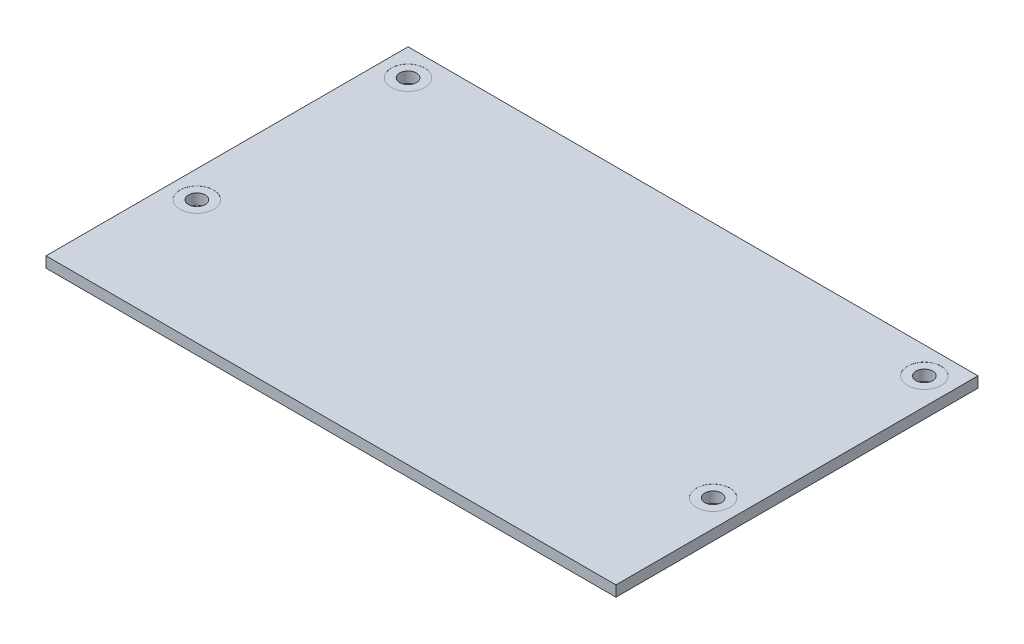
ISO-10303-21;
HEADER;
FILE_DESCRIPTION(('STEP AP214'),'2;1');
FILE_NAME('part.step','',(''),(''),'','','');
FILE_SCHEMA(('AUTOMOTIVE_DESIGN { 1 0 10303 214 1 1 1 1 }'));
ENDSEC;
DATA;
#1=APPLICATION_CONTEXT('core data for automotive mechanical design processes');
#2=APPLICATION_PROTOCOL_DEFINITION('international standard','automotive_design',2000,#1);
#3=PRODUCT_CONTEXT('',#1,'mechanical');
#4=PRODUCT('Part','Part','',(#3));
#5=PRODUCT_RELATED_PRODUCT_CATEGORY('part','',(#4));
#6=PRODUCT_DEFINITION_FORMATION('','',#4);
#7=PRODUCT_DEFINITION_CONTEXT('part definition',#1,'design');
#8=PRODUCT_DEFINITION('design','',#6,#7);
#9=PRODUCT_DEFINITION_SHAPE('','',#8);
#10=(LENGTH_UNIT() NAMED_UNIT(*) SI_UNIT(.MILLI.,.METRE.));
#11=(NAMED_UNIT(*) PLANE_ANGLE_UNIT() SI_UNIT($,.RADIAN.));
#12=(NAMED_UNIT(*) SI_UNIT($,.STERADIAN.) SOLID_ANGLE_UNIT());
#13=UNCERTAINTY_MEASURE_WITH_UNIT(LENGTH_MEASURE(1.E-05),#10,'distance_accuracy_value','');
#14=(GEOMETRIC_REPRESENTATION_CONTEXT(3) GLOBAL_UNCERTAINTY_ASSIGNED_CONTEXT((#13)) GLOBAL_UNIT_ASSIGNED_CONTEXT((#10,
#11,#12)) REPRESENTATION_CONTEXT('',''));
#15=CARTESIAN_POINT('',(0.,0.,0.));
#16=DIRECTION('',(0.,0.,1.));
#17=DIRECTION('',(1.,0.,0.));
#18=AXIS2_PLACEMENT_3D('',#15,#16,#17);
#19=CARTESIAN_POINT('',(-38.5,1.59,-23.));
#20=DIRECTION('',(0.,1.,0.));
#21=DIRECTION('',(0.,0.,1.));
#22=AXIS2_PLACEMENT_3D('',#19,#20,#21);
#23=CYLINDRICAL_SURFACE('',#22,2.5);
#24=CARTESIAN_POINT('',(-38.5,1.6,-23.));
#25=DIRECTION('',(0.,1.,0.));
#26=DIRECTION('',(0.,0.,1.));
#27=AXIS2_PLACEMENT_3D('',#24,#25,#26);
#28=CIRCLE('',#27,2.5);
#29=CARTESIAN_POINT('',(-38.5,1.6,-20.5));
#30=VERTEX_POINT('',#29);
#31=EDGE_CURVE('E115',#30,#30,#28,.F.);
#32=ORIENTED_EDGE('',*,*,#31,.F.);
#33=EDGE_LOOP('',(#32));
#34=FACE_BOUND('',#33,.T.);
#35=CARTESIAN_POINT('',(-38.5,1.59,-23.));
#36=DIRECTION('',(0.,1.,0.));
#37=DIRECTION('',(0.,0.,1.));
#38=AXIS2_PLACEMENT_3D('',#35,#36,#37);
#39=CIRCLE('',#38,2.5);
#40=CARTESIAN_POINT('',(-38.5,1.59,-20.5));
#41=VERTEX_POINT('',#40);
#42=EDGE_CURVE('E112',#41,#41,#39,.T.);
#43=ORIENTED_EDGE('',*,*,#42,.F.);
#44=EDGE_LOOP('',(#43));
#45=FACE_BOUND('',#44,.T.);
#46=ADVANCED_FACE('F16',(#34,#45),#23,.F.);
#47=CARTESIAN_POINT('',(38.5,1.59,-23.));
#48=DIRECTION('',(0.,1.,0.));
#49=DIRECTION('',(0.,0.,1.));
#50=AXIS2_PLACEMENT_3D('',#47,#48,#49);
#51=CYLINDRICAL_SURFACE('',#50,2.5);
#52=CARTESIAN_POINT('',(38.5,1.6,-23.));
#53=DIRECTION('',(0.,1.,0.));
#54=DIRECTION('',(0.,0.,1.));
#55=AXIS2_PLACEMENT_3D('',#52,#53,#54);
#56=CIRCLE('',#55,2.5);
#57=CARTESIAN_POINT('',(38.5,1.6,-20.5));
#58=VERTEX_POINT('',#57);
#59=EDGE_CURVE('E19',#58,#58,#56,.F.);
#60=ORIENTED_EDGE('',*,*,#59,.F.);
#61=EDGE_LOOP('',(#60));
#62=FACE_BOUND('',#61,.T.);
#63=CARTESIAN_POINT('',(38.5,1.59,-23.));
#64=DIRECTION('',(0.,1.,0.));
#65=DIRECTION('',(0.,0.,1.));
#66=AXIS2_PLACEMENT_3D('',#63,#64,#65);
#67=CIRCLE('',#66,2.5);
#68=CARTESIAN_POINT('',(38.5,1.59,-20.5));
#69=VERTEX_POINT('',#68);
#70=EDGE_CURVE('E109',#69,#69,#67,.T.);
#71=ORIENTED_EDGE('',*,*,#70,.F.);
#72=EDGE_LOOP('',(#71));
#73=FACE_BOUND('',#72,.T.);
#74=ADVANCED_FACE('F128',(#62,#73),#51,.F.);
#75=CARTESIAN_POINT('',(38.5,1.59,8.5));
#76=DIRECTION('',(0.,1.,0.));
#77=DIRECTION('',(0.,0.,1.));
#78=AXIS2_PLACEMENT_3D('',#75,#76,#77);
#79=CYLINDRICAL_SURFACE('',#78,2.5);
#80=CARTESIAN_POINT('',(38.5,1.6,8.5));
#81=DIRECTION('',(0.,1.,0.));
#82=DIRECTION('',(0.,0.,1.));
#83=AXIS2_PLACEMENT_3D('',#80,#81,#82);
#84=CIRCLE('',#83,2.5);
#85=CARTESIAN_POINT('',(38.5,1.6,11.));
#86=VERTEX_POINT('',#85);
#87=EDGE_CURVE('E120',#86,#86,#84,.F.);
#88=ORIENTED_EDGE('',*,*,#87,.F.);
#89=EDGE_LOOP('',(#88));
#90=FACE_BOUND('',#89,.T.);
#91=CARTESIAN_POINT('',(38.5,1.59,8.5));
#92=DIRECTION('',(0.,1.,0.));
#93=DIRECTION('',(0.,0.,1.));
#94=AXIS2_PLACEMENT_3D('',#91,#92,#93);
#95=CIRCLE('',#94,2.5);
#96=CARTESIAN_POINT('',(38.5,1.59,11.));
#97=VERTEX_POINT('',#96);
#98=EDGE_CURVE('E106',#97,#97,#95,.T.);
#99=ORIENTED_EDGE('',*,*,#98,.F.);
#100=EDGE_LOOP('',(#99));
#101=FACE_BOUND('',#100,.T.);
#102=ADVANCED_FACE('F131',(#90,#101),#79,.F.);
#103=CARTESIAN_POINT('',(-38.5,1.59,8.5));
#104=DIRECTION('',(0.,1.,0.));
#105=DIRECTION('',(0.,0.,1.));
#106=AXIS2_PLACEMENT_3D('',#103,#104,#105);
#107=CYLINDRICAL_SURFACE('',#106,2.5);
#108=CARTESIAN_POINT('',(-38.5,1.6,8.5));
#109=DIRECTION('',(0.,1.,0.));
#110=DIRECTION('',(0.,0.,1.));
#111=AXIS2_PLACEMENT_3D('',#108,#109,#110);
#112=CIRCLE('',#111,2.5);
#113=CARTESIAN_POINT('',(-38.5,1.6,11.));
#114=VERTEX_POINT('',#113);
#115=EDGE_CURVE('E118',#114,#114,#112,.F.);
#116=ORIENTED_EDGE('',*,*,#115,.F.);
#117=EDGE_LOOP('',(#116));
#118=FACE_BOUND('',#117,.T.);
#119=CARTESIAN_POINT('',(-38.5,1.59,8.5));
#120=DIRECTION('',(0.,1.,0.));
#121=DIRECTION('',(0.,0.,1.));
#122=AXIS2_PLACEMENT_3D('',#119,#120,#121);
#123=CIRCLE('',#122,2.5);
#124=CARTESIAN_POINT('',(-38.5,1.59,11.));
#125=VERTEX_POINT('',#124);
#126=EDGE_CURVE('E67',#125,#125,#123,.T.);
#127=ORIENTED_EDGE('',*,*,#126,.F.);
#128=EDGE_LOOP('',(#127));
#129=FACE_BOUND('',#128,.T.);
#130=ADVANCED_FACE('F214',(#118,#129),#107,.F.);
#131=CARTESIAN_POINT('',(0.,1.6,0.));
#132=DIRECTION('',(0.,1.,0.));
#133=DIRECTION('',(0.,0.,1.));
#134=AXIS2_PLACEMENT_3D('',#131,#132,#133);
#135=PLANE('',#134);
#136=DIRECTION('',(0.,0.,1.));
#137=VECTOR('',#136,1.);
#138=CARTESIAN_POINT('',(42.5,1.6,27.));
#139=LINE('',#138,#137);
#140=CARTESIAN_POINT('',(42.5,1.6,27.));
#141=VERTEX_POINT('',#140);
#142=CARTESIAN_POINT('',(42.5,1.6,-27.));
#143=VERTEX_POINT('',#142);
#144=EDGE_CURVE('E55',#141,#143,#139,.F.);
#145=ORIENTED_EDGE('',*,*,#144,.T.);
#146=DIRECTION('',(1.,0.,0.));
#147=VECTOR('',#146,1.);
#148=CARTESIAN_POINT('',(42.5,1.6,-27.));
#149=LINE('',#148,#147);
#150=CARTESIAN_POINT('',(-42.5,1.6,-27.));
#151=VERTEX_POINT('',#150);
#152=EDGE_CURVE('E189',#143,#151,#149,.F.);
#153=ORIENTED_EDGE('',*,*,#152,.T.);
#154=DIRECTION('',(0.,0.,-1.));
#155=VECTOR('',#154,1.);
#156=CARTESIAN_POINT('',(-42.5,1.6,27.));
#157=LINE('',#156,#155);
#158=CARTESIAN_POINT('',(-42.5,1.6,27.));
#159=VERTEX_POINT('',#158);
#160=EDGE_CURVE('E61',#151,#159,#157,.F.);
#161=ORIENTED_EDGE('',*,*,#160,.T.);
#162=DIRECTION('',(-1.,0.,0.));
#163=VECTOR('',#162,1.);
#164=CARTESIAN_POINT('',(42.5,1.6,27.));
#165=LINE('',#164,#163);
#166=EDGE_CURVE('E58',#159,#141,#165,.F.);
#167=ORIENTED_EDGE('',*,*,#166,.T.);
#168=EDGE_LOOP('',(#145,#153,#161,#167));
#169=FACE_BOUND('',#168,.T.);
#170=ORIENTED_EDGE('',*,*,#31,.T.);
#171=EDGE_LOOP('',(#170));
#172=FACE_BOUND('',#171,.T.);
#173=ORIENTED_EDGE('',*,*,#115,.T.);
#174=EDGE_LOOP('',(#173));
#175=FACE_BOUND('',#174,.T.);
#176=ORIENTED_EDGE('',*,*,#87,.T.);
#177=EDGE_LOOP('',(#176));
#178=FACE_BOUND('',#177,.T.);
#179=ORIENTED_EDGE('',*,*,#59,.T.);
#180=EDGE_LOOP('',(#179));
#181=FACE_BOUND('',#180,.T.);
#182=ADVANCED_FACE('F59',(#169,#172,#175,#178,#181),#135,.T.);
#183=CARTESIAN_POINT('',(-38.5,1.59,-23.));
#184=DIRECTION('',(0.,1.,0.));
#185=DIRECTION('',(0.,0.,1.));
#186=AXIS2_PLACEMENT_3D('',#183,#184,#185);
#187=PLANE('',#186);
#188=ORIENTED_EDGE('',*,*,#42,.T.);
#189=EDGE_LOOP('',(#188));
#190=FACE_BOUND('',#189,.T.);
#191=CARTESIAN_POINT('',(-38.5,1.59,-23.));
#192=DIRECTION('',(0.,-1.,0.));
#193=DIRECTION('',(0.,0.,-1.));
#194=AXIS2_PLACEMENT_3D('',#191,#192,#193);
#195=CIRCLE('',#194,1.25);
#196=CARTESIAN_POINT('',(-38.5,1.59,-24.25));
#197=VERTEX_POINT('',#196);
#198=EDGE_CURVE('E100',#197,#197,#195,.T.);
#199=ORIENTED_EDGE('',*,*,#198,.T.);
#200=EDGE_LOOP('',(#199));
#201=FACE_BOUND('',#200,.T.);
#202=ADVANCED_FACE('F138',(#190,#201),#187,.T.);
#203=CARTESIAN_POINT('',(38.5,1.59,-23.));
#204=DIRECTION('',(0.,1.,0.));
#205=DIRECTION('',(0.,0.,1.));
#206=AXIS2_PLACEMENT_3D('',#203,#204,#205);
#207=PLANE('',#206);
#208=ORIENTED_EDGE('',*,*,#70,.T.);
#209=EDGE_LOOP('',(#208));
#210=FACE_BOUND('',#209,.T.);
#211=CARTESIAN_POINT('',(38.5,1.59,-23.));
#212=DIRECTION('',(0.,-1.,0.));
#213=DIRECTION('',(0.,0.,-1.));
#214=AXIS2_PLACEMENT_3D('',#211,#212,#213);
#215=CIRCLE('',#214,1.25);
#216=CARTESIAN_POINT('',(38.5,1.59,-24.25));
#217=VERTEX_POINT('',#216);
#218=EDGE_CURVE('E97',#217,#217,#215,.T.);
#219=ORIENTED_EDGE('',*,*,#218,.T.);
#220=EDGE_LOOP('',(#219));
#221=FACE_BOUND('',#220,.T.);
#222=ADVANCED_FACE('F134',(#210,#221),#207,.T.);
#223=CARTESIAN_POINT('',(38.5,1.59,8.5));
#224=DIRECTION('',(0.,1.,0.));
#225=DIRECTION('',(0.,0.,1.));
#226=AXIS2_PLACEMENT_3D('',#223,#224,#225);
#227=PLANE('',#226);
#228=ORIENTED_EDGE('',*,*,#98,.T.);
#229=EDGE_LOOP('',(#228));
#230=FACE_BOUND('',#229,.T.);
#231=CARTESIAN_POINT('',(38.5,1.59,8.5));
#232=DIRECTION('',(0.,-1.,0.));
#233=DIRECTION('',(0.,0.,-1.));
#234=AXIS2_PLACEMENT_3D('',#231,#232,#233);
#235=CIRCLE('',#234,1.25);
#236=CARTESIAN_POINT('',(38.5,1.59,7.25));
#237=VERTEX_POINT('',#236);
#238=EDGE_CURVE('E94',#237,#237,#235,.T.);
#239=ORIENTED_EDGE('',*,*,#238,.T.);
#240=EDGE_LOOP('',(#239));
#241=FACE_BOUND('',#240,.T.);
#242=ADVANCED_FACE('F137',(#230,#241),#227,.T.);
#243=CARTESIAN_POINT('',(-38.5,1.59,8.5));
#244=DIRECTION('',(0.,1.,0.));
#245=DIRECTION('',(0.,0.,1.));
#246=AXIS2_PLACEMENT_3D('',#243,#244,#245);
#247=PLANE('',#246);
#248=ORIENTED_EDGE('',*,*,#126,.T.);
#249=EDGE_LOOP('',(#248));
#250=FACE_BOUND('',#249,.T.);
#251=CARTESIAN_POINT('',(-38.5,1.59,8.5));
#252=DIRECTION('',(0.,-1.,0.));
#253=DIRECTION('',(0.,0.,-1.));
#254=AXIS2_PLACEMENT_3D('',#251,#252,#253);
#255=CIRCLE('',#254,1.25);
#256=CARTESIAN_POINT('',(-38.5,1.59,7.25));
#257=VERTEX_POINT('',#256);
#258=EDGE_CURVE('E91',#257,#257,#255,.T.);
#259=ORIENTED_EDGE('',*,*,#258,.T.);
#260=EDGE_LOOP('',(#259));
#261=FACE_BOUND('',#260,.T.);
#262=ADVANCED_FACE('F202',(#250,#261),#247,.T.);
#263=CARTESIAN_POINT('',(42.5,1.6,27.));
#264=DIRECTION('',(0.,0.,-1.));
#265=DIRECTION('',(-1.,0.,0.));
#266=AXIS2_PLACEMENT_3D('',#263,#264,#265);
#267=PLANE('',#266);
#268=DIRECTION('',(0.,1.,0.));
#269=VECTOR('',#268,1.);
#270=CARTESIAN_POINT('',(42.5,1.6,27.));
#271=LINE('',#270,#269);
#272=CARTESIAN_POINT('',(42.5,0.,27.));
#273=VERTEX_POINT('',#272);
#274=EDGE_CURVE('E66',#273,#141,#271,.T.);
#275=ORIENTED_EDGE('',*,*,#274,.T.);
#276=ORIENTED_EDGE('',*,*,#166,.F.);
#277=DIRECTION('',(0.,1.,0.));
#278=VECTOR('',#277,1.);
#279=CARTESIAN_POINT('',(-42.5,1.6,27.));
#280=LINE('',#279,#278);
#281=CARTESIAN_POINT('',(-42.5,0.,27.));
#282=VERTEX_POINT('',#281);
#283=EDGE_CURVE('E103',#159,#282,#280,.F.);
#284=ORIENTED_EDGE('',*,*,#283,.T.);
#285=DIRECTION('',(1.,0.,0.));
#286=VECTOR('',#285,1.);
#287=CARTESIAN_POINT('',(0.,0.,27.));
#288=LINE('',#287,#286);
#289=EDGE_CURVE('E78',#282,#273,#288,.T.);
#290=ORIENTED_EDGE('',*,*,#289,.T.);
#291=EDGE_LOOP('',(#275,#276,#284,#290));
#292=FACE_BOUND('',#291,.T.);
#293=ADVANCED_FACE('F77',(#292),#267,.F.);
#294=CARTESIAN_POINT('',(42.5,1.6,27.));
#295=DIRECTION('',(-1.,0.,0.));
#296=DIRECTION('',(0.,0.,1.));
#297=AXIS2_PLACEMENT_3D('',#294,#295,#296);
#298=PLANE('',#297);
#299=DIRECTION('',(0.,1.,0.));
#300=VECTOR('',#299,1.);
#301=CARTESIAN_POINT('',(42.5,1.6,-27.));
#302=LINE('',#301,#300);
#303=CARTESIAN_POINT('',(42.5,0.,-27.));
#304=VERTEX_POINT('',#303);
#305=EDGE_CURVE('E74',#304,#143,#302,.T.);
#306=ORIENTED_EDGE('',*,*,#305,.T.);
#307=ORIENTED_EDGE('',*,*,#144,.F.);
#308=ORIENTED_EDGE('',*,*,#274,.F.);
#309=DIRECTION('',(0.,0.,1.));
#310=VECTOR('',#309,1.);
#311=CARTESIAN_POINT('',(42.5,0.,0.));
#312=LINE('',#311,#310);
#313=EDGE_CURVE('E179',#273,#304,#312,.F.);
#314=ORIENTED_EDGE('',*,*,#313,.T.);
#315=EDGE_LOOP('',(#306,#307,#308,#314));
#316=FACE_BOUND('',#315,.T.);
#317=ADVANCED_FACE('F71',(#316),#298,.F.);
#318=CARTESIAN_POINT('',(42.5,1.6,-27.));
#319=DIRECTION('',(0.,0.,1.));
#320=DIRECTION('',(1.,0.,0.));
#321=AXIS2_PLACEMENT_3D('',#318,#319,#320);
#322=PLANE('',#321);
#323=DIRECTION('',(0.,1.,0.));
#324=VECTOR('',#323,1.);
#325=CARTESIAN_POINT('',(-42.5,1.6,-27.));
#326=LINE('',#325,#324);
#327=CARTESIAN_POINT('',(-42.5,0.,-27.));
#328=VERTEX_POINT('',#327);
#329=EDGE_CURVE('E34',#328,#151,#326,.T.);
#330=ORIENTED_EDGE('',*,*,#329,.T.);
#331=ORIENTED_EDGE('',*,*,#152,.F.);
#332=ORIENTED_EDGE('',*,*,#305,.F.);
#333=DIRECTION('',(1.,0.,0.));
#334=VECTOR('',#333,1.);
#335=CARTESIAN_POINT('',(0.,0.,-27.));
#336=LINE('',#335,#334);
#337=EDGE_CURVE('E178',#304,#328,#336,.F.);
#338=ORIENTED_EDGE('',*,*,#337,.T.);
#339=EDGE_LOOP('',(#330,#331,#332,#338));
#340=FACE_BOUND('',#339,.T.);
#341=ADVANCED_FACE('F190',(#340),#322,.F.);
#342=CARTESIAN_POINT('',(-42.5,1.6,27.));
#343=DIRECTION('',(1.,0.,0.));
#344=DIRECTION('',(0.,0.,-1.));
#345=AXIS2_PLACEMENT_3D('',#342,#343,#344);
#346=PLANE('',#345);
#347=ORIENTED_EDGE('',*,*,#283,.F.);
#348=ORIENTED_EDGE('',*,*,#160,.F.);
#349=ORIENTED_EDGE('',*,*,#329,.F.);
#350=DIRECTION('',(0.,0.,1.));
#351=VECTOR('',#350,1.);
#352=CARTESIAN_POINT('',(-42.5,0.,0.));
#353=LINE('',#352,#351);
#354=EDGE_CURVE('E90',#328,#282,#353,.T.);
#355=ORIENTED_EDGE('',*,*,#354,.T.);
#356=EDGE_LOOP('',(#347,#348,#349,#355));
#357=FACE_BOUND('',#356,.T.);
#358=ADVANCED_FACE('F156',(#357),#346,.F.);
#359=CARTESIAN_POINT('',(-38.5,1.6,-23.));
#360=DIRECTION('',(0.,-1.,0.));
#361=DIRECTION('',(0.,0.,-1.));
#362=AXIS2_PLACEMENT_3D('',#359,#360,#361);
#363=CYLINDRICAL_SURFACE('',#362,1.25);
#364=CARTESIAN_POINT('',(-38.5,0.,-23.));
#365=DIRECTION('',(0.,-1.,0.));
#366=DIRECTION('',(0.,0.,-1.));
#367=AXIS2_PLACEMENT_3D('',#364,#365,#366);
#368=CIRCLE('',#367,1.25);
#369=CARTESIAN_POINT('',(-38.5,0.,-24.25));
#370=VERTEX_POINT('',#369);
#371=EDGE_CURVE('E87',#370,#370,#368,.T.);
#372=ORIENTED_EDGE('',*,*,#371,.T.);
#373=EDGE_LOOP('',(#372));
#374=FACE_BOUND('',#373,.T.);
#375=ORIENTED_EDGE('',*,*,#198,.F.);
#376=EDGE_LOOP('',(#375));
#377=FACE_BOUND('',#376,.T.);
#378=ADVANCED_FACE('F145',(#374,#377),#363,.F.);
#379=CARTESIAN_POINT('',(38.5,1.6,-23.));
#380=DIRECTION('',(0.,-1.,0.));
#381=DIRECTION('',(0.,0.,-1.));
#382=AXIS2_PLACEMENT_3D('',#379,#380,#381);
#383=CYLINDRICAL_SURFACE('',#382,1.25);
#384=CARTESIAN_POINT('',(38.5,0.,-23.));
#385=DIRECTION('',(0.,-1.,0.));
#386=DIRECTION('',(0.,0.,-1.));
#387=AXIS2_PLACEMENT_3D('',#384,#385,#386);
#388=CIRCLE('',#387,1.25);
#389=CARTESIAN_POINT('',(38.5,0.,-24.25));
#390=VERTEX_POINT('',#389);
#391=EDGE_CURVE('E84',#390,#390,#388,.T.);
#392=ORIENTED_EDGE('',*,*,#391,.T.);
#393=EDGE_LOOP('',(#392));
#394=FACE_BOUND('',#393,.T.);
#395=ORIENTED_EDGE('',*,*,#218,.F.);
#396=EDGE_LOOP('',(#395));
#397=FACE_BOUND('',#396,.T.);
#398=ADVANCED_FACE('F142',(#394,#397),#383,.F.);
#399=CARTESIAN_POINT('',(38.5,1.6,8.5));
#400=DIRECTION('',(0.,-1.,0.));
#401=DIRECTION('',(0.,0.,-1.));
#402=AXIS2_PLACEMENT_3D('',#399,#400,#401);
#403=CYLINDRICAL_SURFACE('',#402,1.25);
#404=CARTESIAN_POINT('',(38.5,0.,8.5));
#405=DIRECTION('',(0.,-1.,0.));
#406=DIRECTION('',(0.,0.,-1.));
#407=AXIS2_PLACEMENT_3D('',#404,#405,#406);
#408=CIRCLE('',#407,1.25);
#409=CARTESIAN_POINT('',(38.5,0.,7.25));
#410=VERTEX_POINT('',#409);
#411=EDGE_CURVE('E25',#410,#410,#408,.T.);
#412=ORIENTED_EDGE('',*,*,#411,.T.);
#413=EDGE_LOOP('',(#412));
#414=FACE_BOUND('',#413,.T.);
#415=ORIENTED_EDGE('',*,*,#238,.F.);
#416=EDGE_LOOP('',(#415));
#417=FACE_BOUND('',#416,.T.);
#418=ADVANCED_FACE('F144',(#414,#417),#403,.F.);
#419=CARTESIAN_POINT('',(-38.5,1.6,8.5));
#420=DIRECTION('',(0.,-1.,0.));
#421=DIRECTION('',(0.,0.,-1.));
#422=AXIS2_PLACEMENT_3D('',#419,#420,#421);
#423=CYLINDRICAL_SURFACE('',#422,1.25);
#424=CARTESIAN_POINT('',(-38.5,0.,8.5));
#425=DIRECTION('',(0.,-1.,0.));
#426=DIRECTION('',(0.,0.,-1.));
#427=AXIS2_PLACEMENT_3D('',#424,#425,#426);
#428=CIRCLE('',#427,1.25);
#429=CARTESIAN_POINT('',(-38.5,0.,7.25));
#430=VERTEX_POINT('',#429);
#431=EDGE_CURVE('E11',#430,#430,#428,.T.);
#432=ORIENTED_EDGE('',*,*,#431,.T.);
#433=EDGE_LOOP('',(#432));
#434=FACE_BOUND('',#433,.T.);
#435=ORIENTED_EDGE('',*,*,#258,.F.);
#436=EDGE_LOOP('',(#435));
#437=FACE_BOUND('',#436,.T.);
#438=ADVANCED_FACE('F153',(#434,#437),#423,.F.);
#439=CARTESIAN_POINT('',(0.,0.,0.));
#440=DIRECTION('',(0.,1.,0.));
#441=DIRECTION('',(0.,0.,1.));
#442=AXIS2_PLACEMENT_3D('',#439,#440,#441);
#443=PLANE('',#442);
#444=ORIENTED_EDGE('',*,*,#431,.F.);
#445=EDGE_LOOP('',(#444));
#446=FACE_BOUND('',#445,.T.);
#447=ORIENTED_EDGE('',*,*,#411,.F.);
#448=EDGE_LOOP('',(#447));
#449=FACE_BOUND('',#448,.T.);
#450=ORIENTED_EDGE('',*,*,#391,.F.);
#451=EDGE_LOOP('',(#450));
#452=FACE_BOUND('',#451,.T.);
#453=ORIENTED_EDGE('',*,*,#371,.F.);
#454=EDGE_LOOP('',(#453));
#455=FACE_BOUND('',#454,.T.);
#456=ORIENTED_EDGE('',*,*,#337,.F.);
#457=ORIENTED_EDGE('',*,*,#313,.F.);
#458=ORIENTED_EDGE('',*,*,#289,.F.);
#459=ORIENTED_EDGE('',*,*,#354,.F.);
#460=EDGE_LOOP('',(#456,#457,#458,#459));
#461=FACE_BOUND('',#460,.T.);
#462=ADVANCED_FACE('F159',(#446,#449,#452,#455,#461),#443,.F.);
#463=CLOSED_SHELL('',(#46,#74,#102,#130,#182,#202,#222,#242,#262,#293,#317,#341,#358,#378,#398,
#418,#438,#462));
#464=MANIFOLD_SOLID_BREP('B1',#463);
#465=ADVANCED_BREP_SHAPE_REPRESENTATION('',(#18,#464),#14);
#466=SHAPE_DEFINITION_REPRESENTATION(#9,#465);
ENDSEC;
END-ISO-10303-21;
